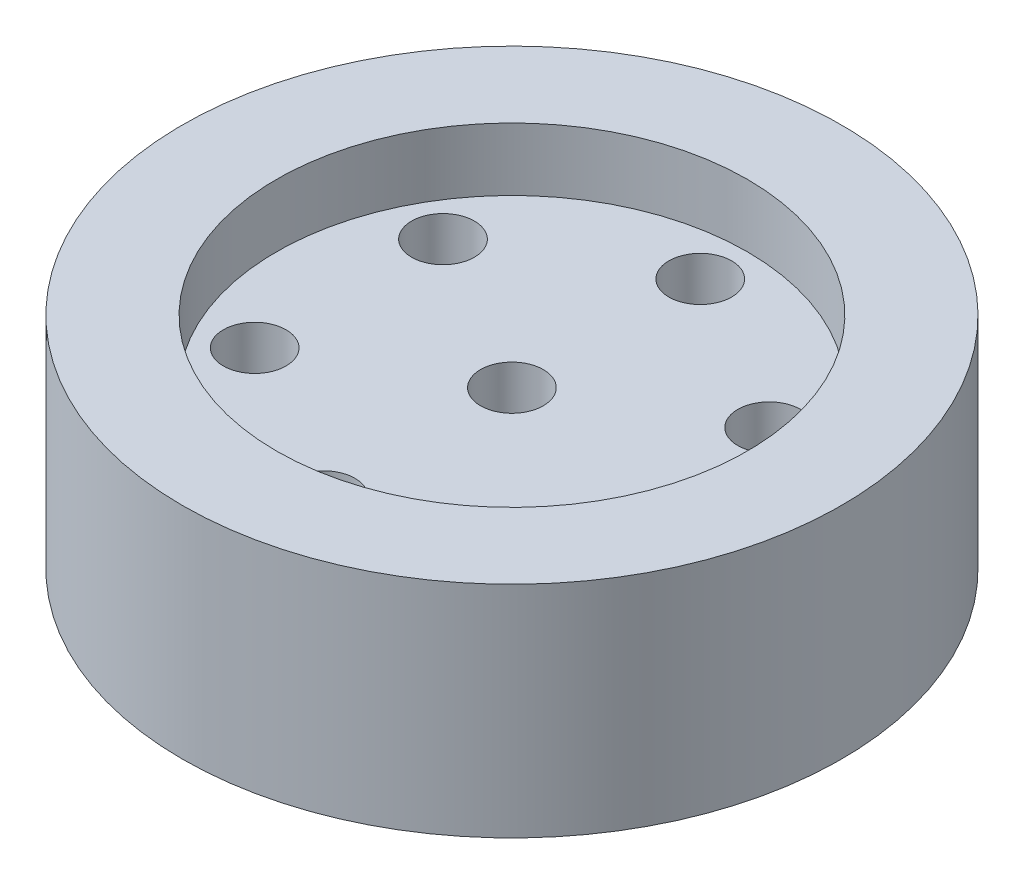
ISO-10303-21;
HEADER;
FILE_DESCRIPTION(('STEP AP214'),'2;1');
FILE_NAME('part.step','',(''),(''),'','','');
FILE_SCHEMA(('AUTOMOTIVE_DESIGN { 1 0 10303 214 1 1 1 1 }'));
ENDSEC;
DATA;
#1=APPLICATION_CONTEXT('core data for automotive mechanical design processes');
#2=APPLICATION_PROTOCOL_DEFINITION('international standard','automotive_design',2000,#1);
#3=PRODUCT_CONTEXT('',#1,'mechanical');
#4=PRODUCT('Part','Part','',(#3));
#5=PRODUCT_RELATED_PRODUCT_CATEGORY('part','',(#4));
#6=PRODUCT_DEFINITION_FORMATION('','',#4);
#7=PRODUCT_DEFINITION_CONTEXT('part definition',#1,'design');
#8=PRODUCT_DEFINITION('design','',#6,#7);
#9=PRODUCT_DEFINITION_SHAPE('','',#8);
#10=(LENGTH_UNIT() NAMED_UNIT(*) SI_UNIT(.MILLI.,.METRE.));
#11=(NAMED_UNIT(*) PLANE_ANGLE_UNIT() SI_UNIT($,.RADIAN.));
#12=(NAMED_UNIT(*) SI_UNIT($,.STERADIAN.) SOLID_ANGLE_UNIT());
#13=UNCERTAINTY_MEASURE_WITH_UNIT(LENGTH_MEASURE(1.E-05),#10,'distance_accuracy_value','');
#14=(GEOMETRIC_REPRESENTATION_CONTEXT(3) GLOBAL_UNCERTAINTY_ASSIGNED_CONTEXT((#13)) GLOBAL_UNIT_ASSIGNED_CONTEXT((#10,
#11,#12)) REPRESENTATION_CONTEXT('',''));
#15=CARTESIAN_POINT('',(0.,0.,0.));
#16=DIRECTION('',(0.,0.,1.));
#17=DIRECTION('',(1.,0.,0.));
#18=AXIS2_PLACEMENT_3D('',#15,#16,#17);
#19=CARTESIAN_POINT('',(0.,14.,0.));
#20=DIRECTION('',(0.,-1.,0.));
#21=DIRECTION('',(0.,0.,-1.));
#22=AXIS2_PLACEMENT_3D('',#19,#20,#21);
#23=CYLINDRICAL_SURFACE('',#22,21.);
#24=CARTESIAN_POINT('',(0.,14.,0.));
#25=DIRECTION('',(0.,1.,0.));
#26=DIRECTION('',(0.,0.,1.));
#27=AXIS2_PLACEMENT_3D('',#24,#25,#26);
#28=CIRCLE('',#27,21.);
#29=CARTESIAN_POINT('',(0.,14.,21.));
#30=VERTEX_POINT('',#29);
#31=EDGE_CURVE('E10',#30,#30,#28,.T.);
#32=ORIENTED_EDGE('',*,*,#31,.F.);
#33=EDGE_LOOP('',(#32));
#34=FACE_BOUND('',#33,.T.);
#35=CARTESIAN_POINT('',(0.,0.,0.));
#36=DIRECTION('',(0.,1.,0.));
#37=DIRECTION('',(0.,0.,1.));
#38=AXIS2_PLACEMENT_3D('',#35,#36,#37);
#39=CIRCLE('',#38,21.);
#40=CARTESIAN_POINT('',(0.,0.,21.));
#41=VERTEX_POINT('',#40);
#42=EDGE_CURVE('E44',#41,#41,#39,.T.);
#43=ORIENTED_EDGE('',*,*,#42,.T.);
#44=EDGE_LOOP('',(#43));
#45=FACE_BOUND('',#44,.T.);
#46=ADVANCED_FACE('F41',(#34,#45),#23,.T.);
#47=CARTESIAN_POINT('',(0.,14.,0.));
#48=DIRECTION('',(0.,1.,0.));
#49=DIRECTION('',(0.,0.,1.));
#50=AXIS2_PLACEMENT_3D('',#47,#48,#49);
#51=PLANE('',#50);
#52=CARTESIAN_POINT('',(0.,14.,0.));
#53=DIRECTION('',(0.,1.,0.));
#54=DIRECTION('',(0.,0.,1.));
#55=AXIS2_PLACEMENT_3D('',#52,#53,#54);
#56=CIRCLE('',#55,15.);
#57=CARTESIAN_POINT('',(0.,14.,15.));
#58=VERTEX_POINT('',#57);
#59=EDGE_CURVE('E55',#58,#58,#56,.T.);
#60=ORIENTED_EDGE('',*,*,#59,.F.);
#61=EDGE_LOOP('',(#60));
#62=FACE_BOUND('',#61,.T.);
#63=ORIENTED_EDGE('',*,*,#31,.T.);
#64=EDGE_LOOP('',(#63));
#65=FACE_BOUND('',#64,.T.);
#66=ADVANCED_FACE('F167',(#62,#65),#51,.T.);
#67=CARTESIAN_POINT('',(0.,0.,0.));
#68=DIRECTION('',(0.,1.,0.));
#69=DIRECTION('',(0.,0.,1.));
#70=AXIS2_PLACEMENT_3D('',#67,#68,#69);
#71=PLANE('',#70);
#72=CARTESIAN_POINT('',(0.,0.,0.));
#73=DIRECTION('',(0.,-1.,0.));
#74=DIRECTION('',(0.,0.,-1.));
#75=AXIS2_PLACEMENT_3D('',#72,#73,#74);
#76=CIRCLE('',#75,19.);
#77=CARTESIAN_POINT('',(0.,0.,-19.));
#78=VERTEX_POINT('',#77);
#79=EDGE_CURVE('E63',#78,#78,#76,.T.);
#80=ORIENTED_EDGE('',*,*,#79,.F.);
#81=EDGE_LOOP('',(#80));
#82=FACE_BOUND('',#81,.T.);
#83=ORIENTED_EDGE('',*,*,#42,.F.);
#84=EDGE_LOOP('',(#83));
#85=FACE_BOUND('',#84,.T.);
#86=ADVANCED_FACE('F163',(#82,#85),#71,.F.);
#87=CARTESIAN_POINT('',(0.,10.,0.));
#88=DIRECTION('',(0.,1.,0.));
#89=DIRECTION('',(0.,0.,1.));
#90=AXIS2_PLACEMENT_3D('',#87,#88,#89);
#91=CYLINDRICAL_SURFACE('',#90,15.);
#92=CARTESIAN_POINT('',(0.,10.,0.));
#93=DIRECTION('',(0.,1.,0.));
#94=DIRECTION('',(0.,0.,1.));
#95=AXIS2_PLACEMENT_3D('',#92,#93,#94);
#96=CIRCLE('',#95,15.);
#97=CARTESIAN_POINT('',(0.,10.,15.));
#98=VERTEX_POINT('',#97);
#99=EDGE_CURVE('E53',#98,#98,#96,.T.);
#100=ORIENTED_EDGE('',*,*,#99,.F.);
#101=EDGE_LOOP('',(#100));
#102=FACE_BOUND('',#101,.T.);
#103=ORIENTED_EDGE('',*,*,#59,.T.);
#104=EDGE_LOOP('',(#103));
#105=FACE_BOUND('',#104,.T.);
#106=ADVANCED_FACE('F166',(#102,#105),#91,.F.);
#107=CARTESIAN_POINT('',(0.,10.,0.));
#108=DIRECTION('',(0.,1.,0.));
#109=DIRECTION('',(0.,0.,1.));
#110=AXIS2_PLACEMENT_3D('',#107,#108,#109);
#111=PLANE('',#110);
#112=CARTESIAN_POINT('',(0.,10.,12.));
#113=DIRECTION('',(0.,1.,0.));
#114=DIRECTION('',(0.,0.,1.));
#115=AXIS2_PLACEMENT_3D('',#112,#113,#114);
#116=CIRCLE('',#115,2.);
#117=CARTESIAN_POINT('',(0.,10.,14.));
#118=VERTEX_POINT('',#117);
#119=EDGE_CURVE('E86',#118,#118,#116,.T.);
#120=ORIENTED_EDGE('',*,*,#119,.F.);
#121=EDGE_LOOP('',(#120));
#122=FACE_BOUND('',#121,.T.);
#123=CARTESIAN_POINT('',(-10.392304845413,10.,5.99999999999955));
#124=DIRECTION('',(0.,1.,0.));
#125=DIRECTION('',(0.,0.,1.));
#126=AXIS2_PLACEMENT_3D('',#123,#124,#125);
#127=CIRCLE('',#126,2.00000000000052);
#128=CARTESIAN_POINT('',(-10.392304845413,10.,8.00000000000007));
#129=VERTEX_POINT('',#128);
#130=EDGE_CURVE('E90',#129,#129,#127,.T.);
#131=ORIENTED_EDGE('',*,*,#130,.F.);
#132=EDGE_LOOP('',(#131));
#133=FACE_BOUND('',#132,.T.);
#134=CARTESIAN_POINT('',(-10.3923048454125,10.,-6.00000000000045));
#135=DIRECTION('',(0.,1.,0.));
#136=DIRECTION('',(0.,0.,1.));
#137=AXIS2_PLACEMENT_3D('',#134,#135,#136);
#138=CIRCLE('',#137,2.00000000000097);
#139=CARTESIAN_POINT('',(-10.3923048454125,10.,-3.99999999999948));
#140=VERTEX_POINT('',#139);
#141=EDGE_CURVE('E94',#140,#140,#138,.T.);
#142=ORIENTED_EDGE('',*,*,#141,.F.);
#143=EDGE_LOOP('',(#142));
#144=FACE_BOUND('',#143,.T.);
#145=CARTESIAN_POINT('',(1.01877281101761E-12,10.,-12.));
#146=DIRECTION('',(0.,1.,0.));
#147=DIRECTION('',(0.,0.,1.));
#148=AXIS2_PLACEMENT_3D('',#145,#146,#147);
#149=CIRCLE('',#148,2.00000000000105);
#150=CARTESIAN_POINT('',(1.01877281101761E-12,10.,-9.99999999999894));
#151=VERTEX_POINT('',#150);
#152=EDGE_CURVE('E98',#151,#151,#149,.T.);
#153=ORIENTED_EDGE('',*,*,#152,.F.);
#154=EDGE_LOOP('',(#153));
#155=FACE_BOUND('',#154,.T.);
#156=CARTESIAN_POINT('',(10.392304845414,10.,-5.99999999999956));
#157=DIRECTION('',(0.,1.,0.));
#158=DIRECTION('',(0.,0.,1.));
#159=AXIS2_PLACEMENT_3D('',#156,#157,#158);
#160=CIRCLE('',#159,2.00000000000066);
#161=CARTESIAN_POINT('',(10.392304845414,10.,-3.9999999999989));
#162=VERTEX_POINT('',#161);
#163=EDGE_CURVE('E102',#162,#162,#160,.T.);
#164=ORIENTED_EDGE('',*,*,#163,.F.);
#165=EDGE_LOOP('',(#164));
#166=FACE_BOUND('',#165,.T.);
#167=CARTESIAN_POINT('',(10.3923048454135,10.,6.00000000000045));
#168=DIRECTION('',(0.,1.,0.));
#169=DIRECTION('',(0.,0.,1.));
#170=AXIS2_PLACEMENT_3D('',#167,#168,#169);
#171=CIRCLE('',#170,2.00000000000015);
#172=CARTESIAN_POINT('',(10.3923048454135,10.,8.0000000000006));
#173=VERTEX_POINT('',#172);
#174=EDGE_CURVE('E106',#173,#173,#171,.T.);
#175=ORIENTED_EDGE('',*,*,#174,.F.);
#176=EDGE_LOOP('',(#175));
#177=FACE_BOUND('',#176,.T.);
#178=CARTESIAN_POINT('',(0.,10.,0.));
#179=DIRECTION('',(0.,1.,0.));
#180=DIRECTION('',(0.,0.,1.));
#181=AXIS2_PLACEMENT_3D('',#178,#179,#180);
#182=CIRCLE('',#181,2.);
#183=CARTESIAN_POINT('',(0.,10.,2.));
#184=VERTEX_POINT('',#183);
#185=EDGE_CURVE('E75',#184,#184,#182,.T.);
#186=ORIENTED_EDGE('',*,*,#185,.F.);
#187=EDGE_LOOP('',(#186));
#188=FACE_BOUND('',#187,.T.);
#189=ORIENTED_EDGE('',*,*,#99,.T.);
#190=EDGE_LOOP('',(#189));
#191=FACE_BOUND('',#190,.T.);
#192=ADVANCED_FACE('F159',(#122,#133,#144,#155,#166,#177,#188,#191),#111,.T.);
#193=CARTESIAN_POINT('',(0.,4.,0.));
#194=DIRECTION('',(0.,-1.,0.));
#195=DIRECTION('',(0.,0.,-1.));
#196=AXIS2_PLACEMENT_3D('',#193,#194,#195);
#197=CYLINDRICAL_SURFACE('',#196,19.);
#198=CARTESIAN_POINT('',(0.,4.,0.));
#199=DIRECTION('',(0.,-1.,0.));
#200=DIRECTION('',(0.,0.,-1.));
#201=AXIS2_PLACEMENT_3D('',#198,#199,#200);
#202=CIRCLE('',#201,19.);
#203=CARTESIAN_POINT('',(0.,4.,-19.));
#204=VERTEX_POINT('',#203);
#205=EDGE_CURVE('E59',#204,#204,#202,.T.);
#206=ORIENTED_EDGE('',*,*,#205,.F.);
#207=EDGE_LOOP('',(#206));
#208=FACE_BOUND('',#207,.T.);
#209=ORIENTED_EDGE('',*,*,#79,.T.);
#210=EDGE_LOOP('',(#209));
#211=FACE_BOUND('',#210,.T.);
#212=ADVANCED_FACE('F141',(#208,#211),#197,.F.);
#213=CARTESIAN_POINT('',(0.,4.,0.));
#214=DIRECTION('',(0.,-1.,0.));
#215=DIRECTION('',(0.,0.,-1.));
#216=AXIS2_PLACEMENT_3D('',#213,#214,#215);
#217=PLANE('',#216);
#218=CARTESIAN_POINT('',(0.,4.,12.));
#219=DIRECTION('',(0.,-1.,0.));
#220=DIRECTION('',(0.,0.,-1.));
#221=AXIS2_PLACEMENT_3D('',#218,#219,#220);
#222=CIRCLE('',#221,2.);
#223=CARTESIAN_POINT('',(0.,4.,10.));
#224=VERTEX_POINT('',#223);
#225=EDGE_CURVE('E110',#224,#224,#222,.T.);
#226=ORIENTED_EDGE('',*,*,#225,.F.);
#227=EDGE_LOOP('',(#226));
#228=FACE_BOUND('',#227,.T.);
#229=CARTESIAN_POINT('',(-10.392304845413,4.,5.99999999999955));
#230=DIRECTION('',(0.,-1.,0.));
#231=DIRECTION('',(0.,0.,-1.));
#232=AXIS2_PLACEMENT_3D('',#229,#230,#231);
#233=CIRCLE('',#232,2.00000000000052);
#234=CARTESIAN_POINT('',(-10.392304845413,4.,3.99999999999904));
#235=VERTEX_POINT('',#234);
#236=EDGE_CURVE('E116',#235,#235,#233,.T.);
#237=ORIENTED_EDGE('',*,*,#236,.F.);
#238=EDGE_LOOP('',(#237));
#239=FACE_BOUND('',#238,.T.);
#240=CARTESIAN_POINT('',(-10.3923048454125,4.,-6.00000000000045));
#241=DIRECTION('',(0.,-1.,0.));
#242=DIRECTION('',(0.,0.,-1.));
#243=AXIS2_PLACEMENT_3D('',#240,#241,#242);
#244=CIRCLE('',#243,2.00000000000097);
#245=CARTESIAN_POINT('',(-10.3923048454125,4.,-8.00000000000142));
#246=VERTEX_POINT('',#245);
#247=EDGE_CURVE('E111',#246,#246,#244,.T.);
#248=ORIENTED_EDGE('',*,*,#247,.F.);
#249=EDGE_LOOP('',(#248));
#250=FACE_BOUND('',#249,.T.);
#251=CARTESIAN_POINT('',(1.01877281101761E-12,4.,-12.));
#252=DIRECTION('',(0.,-1.,0.));
#253=DIRECTION('',(0.,0.,-1.));
#254=AXIS2_PLACEMENT_3D('',#251,#252,#253);
#255=CIRCLE('',#254,2.00000000000105);
#256=CARTESIAN_POINT('',(1.01877281101761E-12,4.,-14.0000000000011));
#257=VERTEX_POINT('',#256);
#258=EDGE_CURVE('E115',#257,#257,#255,.T.);
#259=ORIENTED_EDGE('',*,*,#258,.F.);
#260=EDGE_LOOP('',(#259));
#261=FACE_BOUND('',#260,.T.);
#262=CARTESIAN_POINT('',(10.392304845414,4.,-5.99999999999956));
#263=DIRECTION('',(0.,-1.,0.));
#264=DIRECTION('',(0.,0.,-1.));
#265=AXIS2_PLACEMENT_3D('',#262,#263,#264);
#266=CIRCLE('',#265,2.00000000000066);
#267=CARTESIAN_POINT('',(10.392304845414,4.,-8.00000000000022));
#268=VERTEX_POINT('',#267);
#269=EDGE_CURVE('E120',#268,#268,#266,.T.);
#270=ORIENTED_EDGE('',*,*,#269,.F.);
#271=EDGE_LOOP('',(#270));
#272=FACE_BOUND('',#271,.T.);
#273=CARTESIAN_POINT('',(10.3923048454135,4.,6.00000000000045));
#274=DIRECTION('',(0.,-1.,0.));
#275=DIRECTION('',(0.,0.,-1.));
#276=AXIS2_PLACEMENT_3D('',#273,#274,#275);
#277=CIRCLE('',#276,2.00000000000015);
#278=CARTESIAN_POINT('',(10.3923048454135,4.,4.0000000000003));
#279=VERTEX_POINT('',#278);
#280=EDGE_CURVE('E124',#279,#279,#277,.T.);
#281=ORIENTED_EDGE('',*,*,#280,.F.);
#282=EDGE_LOOP('',(#281));
#283=FACE_BOUND('',#282,.T.);
#284=CARTESIAN_POINT('',(0.,4.,0.));
#285=DIRECTION('',(0.,-1.,0.));
#286=DIRECTION('',(0.,0.,-1.));
#287=AXIS2_PLACEMENT_3D('',#284,#285,#286);
#288=CIRCLE('',#287,5.);
#289=CARTESIAN_POINT('',(0.,4.,-5.));
#290=VERTEX_POINT('',#289);
#291=EDGE_CURVE('E67',#290,#290,#288,.T.);
#292=ORIENTED_EDGE('',*,*,#291,.F.);
#293=EDGE_LOOP('',(#292));
#294=FACE_BOUND('',#293,.T.);
#295=ORIENTED_EDGE('',*,*,#205,.T.);
#296=EDGE_LOOP('',(#295));
#297=FACE_BOUND('',#296,.T.);
#298=ADVANCED_FACE('F137',(#228,#239,#250,#261,#272,#283,#294,#297),#217,.T.);
#299=CARTESIAN_POINT('',(0.,4.,0.));
#300=DIRECTION('',(0.,-1.,0.));
#301=DIRECTION('',(0.,0.,-1.));
#302=AXIS2_PLACEMENT_3D('',#299,#300,#301);
#303=CYLINDRICAL_SURFACE('',#302,5.);
#304=ORIENTED_EDGE('',*,*,#291,.T.);
#305=EDGE_LOOP('',(#304));
#306=FACE_BOUND('',#305,.T.);
#307=CARTESIAN_POINT('',(0.,0.,0.));
#308=DIRECTION('',(0.,-1.,0.));
#309=DIRECTION('',(0.,0.,-1.));
#310=AXIS2_PLACEMENT_3D('',#307,#308,#309);
#311=CIRCLE('',#310,5.);
#312=CARTESIAN_POINT('',(0.,0.,-5.));
#313=VERTEX_POINT('',#312);
#314=EDGE_CURVE('E71',#313,#313,#311,.T.);
#315=ORIENTED_EDGE('',*,*,#314,.F.);
#316=EDGE_LOOP('',(#315));
#317=FACE_BOUND('',#316,.T.);
#318=ADVANCED_FACE('F140',(#306,#317),#303,.T.);
#319=CARTESIAN_POINT('',(0.,0.,0.));
#320=DIRECTION('',(0.,-1.,0.));
#321=DIRECTION('',(0.,0.,-1.));
#322=AXIS2_PLACEMENT_3D('',#319,#320,#321);
#323=CIRCLE('',#322,2.);
#324=CARTESIAN_POINT('',(0.,0.,-2.));
#325=VERTEX_POINT('',#324);
#326=EDGE_CURVE('E82',#325,#325,#323,.T.);
#327=ORIENTED_EDGE('',*,*,#326,.F.);
#328=EDGE_LOOP('',(#327));
#329=FACE_BOUND('',#328,.T.);
#330=ORIENTED_EDGE('',*,*,#314,.T.);
#331=EDGE_LOOP('',(#330));
#332=FACE_BOUND('',#331,.T.);
#333=ADVANCED_FACE('F168',(#329,#332),#71,.F.);
#334=CARTESIAN_POINT('',(0.,14.,0.));
#335=DIRECTION('',(0.,-1.,0.));
#336=DIRECTION('',(0.,0.,-1.));
#337=AXIS2_PLACEMENT_3D('',#334,#335,#336);
#338=CYLINDRICAL_SURFACE('',#337,2.);
#339=ORIENTED_EDGE('',*,*,#185,.T.);
#340=EDGE_LOOP('',(#339));
#341=FACE_BOUND('',#340,.T.);
#342=ORIENTED_EDGE('',*,*,#326,.T.);
#343=EDGE_LOOP('',(#342));
#344=FACE_BOUND('',#343,.T.);
#345=ADVANCED_FACE('F191',(#341,#344),#338,.F.);
#346=CARTESIAN_POINT('',(10.3923048454135,14.,6.00000000000045));
#347=DIRECTION('',(0.,-1.,0.));
#348=DIRECTION('',(0.,0.,-1.));
#349=AXIS2_PLACEMENT_3D('',#346,#347,#348);
#350=CYLINDRICAL_SURFACE('',#349,2.00000000000015);
#351=ORIENTED_EDGE('',*,*,#174,.T.);
#352=EDGE_LOOP('',(#351));
#353=FACE_BOUND('',#352,.T.);
#354=ORIENTED_EDGE('',*,*,#280,.T.);
#355=EDGE_LOOP('',(#354));
#356=FACE_BOUND('',#355,.T.);
#357=ADVANCED_FACE('F194',(#353,#356),#350,.F.);
#358=CARTESIAN_POINT('',(10.392304845414,14.,-5.99999999999956));
#359=DIRECTION('',(0.,-1.,0.));
#360=DIRECTION('',(0.,0.,-1.));
#361=AXIS2_PLACEMENT_3D('',#358,#359,#360);
#362=CYLINDRICAL_SURFACE('',#361,2.00000000000066);
#363=ORIENTED_EDGE('',*,*,#163,.T.);
#364=EDGE_LOOP('',(#363));
#365=FACE_BOUND('',#364,.T.);
#366=ORIENTED_EDGE('',*,*,#269,.T.);
#367=EDGE_LOOP('',(#366));
#368=FACE_BOUND('',#367,.T.);
#369=ADVANCED_FACE('F204',(#365,#368),#362,.F.);
#370=CARTESIAN_POINT('',(1.01877281101761E-12,14.,-12.));
#371=DIRECTION('',(0.,-1.,0.));
#372=DIRECTION('',(0.,0.,-1.));
#373=AXIS2_PLACEMENT_3D('',#370,#371,#372);
#374=CYLINDRICAL_SURFACE('',#373,2.00000000000105);
#375=ORIENTED_EDGE('',*,*,#152,.T.);
#376=EDGE_LOOP('',(#375));
#377=FACE_BOUND('',#376,.T.);
#378=ORIENTED_EDGE('',*,*,#258,.T.);
#379=EDGE_LOOP('',(#378));
#380=FACE_BOUND('',#379,.T.);
#381=ADVANCED_FACE('F200',(#377,#380),#374,.F.);
#382=CARTESIAN_POINT('',(-10.3923048454125,14.,-6.00000000000045));
#383=DIRECTION('',(0.,-1.,0.));
#384=DIRECTION('',(0.,0.,-1.));
#385=AXIS2_PLACEMENT_3D('',#382,#383,#384);
#386=CYLINDRICAL_SURFACE('',#385,2.00000000000097);
#387=ORIENTED_EDGE('',*,*,#141,.T.);
#388=EDGE_LOOP('',(#387));
#389=FACE_BOUND('',#388,.T.);
#390=ORIENTED_EDGE('',*,*,#247,.T.);
#391=EDGE_LOOP('',(#390));
#392=FACE_BOUND('',#391,.T.);
#393=ADVANCED_FACE('F196',(#389,#392),#386,.F.);
#394=CARTESIAN_POINT('',(-10.392304845413,14.,5.99999999999955));
#395=DIRECTION('',(0.,-1.,0.));
#396=DIRECTION('',(0.,0.,-1.));
#397=AXIS2_PLACEMENT_3D('',#394,#395,#396);
#398=CYLINDRICAL_SURFACE('',#397,2.00000000000052);
#399=ORIENTED_EDGE('',*,*,#130,.T.);
#400=EDGE_LOOP('',(#399));
#401=FACE_BOUND('',#400,.T.);
#402=ORIENTED_EDGE('',*,*,#236,.T.);
#403=EDGE_LOOP('',(#402));
#404=FACE_BOUND('',#403,.T.);
#405=ADVANCED_FACE('F199',(#401,#404),#398,.F.);
#406=CARTESIAN_POINT('',(0.,14.,12.));
#407=DIRECTION('',(0.,-1.,0.));
#408=DIRECTION('',(0.,0.,-1.));
#409=AXIS2_PLACEMENT_3D('',#406,#407,#408);
#410=CYLINDRICAL_SURFACE('',#409,2.);
#411=ORIENTED_EDGE('',*,*,#119,.T.);
#412=EDGE_LOOP('',(#411));
#413=FACE_BOUND('',#412,.T.);
#414=ORIENTED_EDGE('',*,*,#225,.T.);
#415=EDGE_LOOP('',(#414));
#416=FACE_BOUND('',#415,.T.);
#417=ADVANCED_FACE('F135',(#413,#416),#410,.F.);
#418=CLOSED_SHELL('',(#46,#66,#86,#106,#192,#212,#298,#318,#333,#345,#357,#369,#381,#393,#405,#417));
#419=MANIFOLD_SOLID_BREP('B2',#418);
#420=ADVANCED_BREP_SHAPE_REPRESENTATION('',(#18,#419),#14);
#421=SHAPE_DEFINITION_REPRESENTATION(#9,#420);
ENDSEC;
END-ISO-10303-21;
